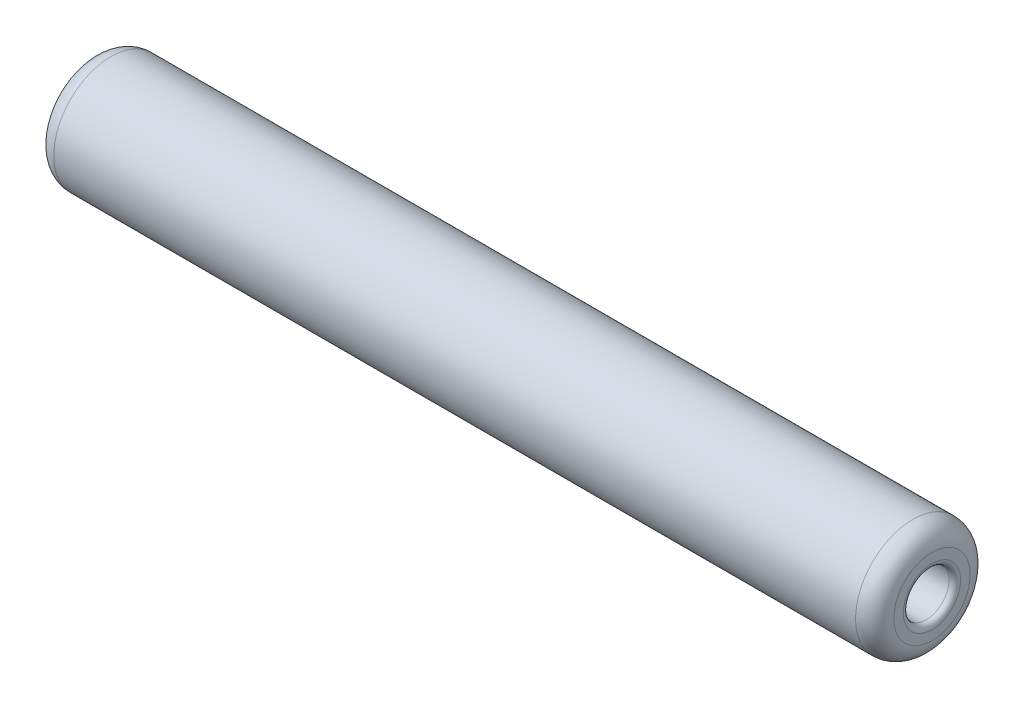
ISO-10303-21;
HEADER;
FILE_DESCRIPTION(('STEP AP214'),'2;1');
FILE_NAME('part.step','',(''),(''),'','','');
FILE_SCHEMA(('AUTOMOTIVE_DESIGN { 1 0 10303 214 1 1 1 1 }'));
ENDSEC;
DATA;
#1=APPLICATION_CONTEXT('core data for automotive mechanical design processes');
#2=APPLICATION_PROTOCOL_DEFINITION('international standard','automotive_design',2000,#1);
#3=PRODUCT_CONTEXT('',#1,'mechanical');
#4=PRODUCT('Part','Part','',(#3));
#5=PRODUCT_RELATED_PRODUCT_CATEGORY('part','',(#4));
#6=PRODUCT_DEFINITION_FORMATION('','',#4);
#7=PRODUCT_DEFINITION_CONTEXT('part definition',#1,'design');
#8=PRODUCT_DEFINITION('design','',#6,#7);
#9=PRODUCT_DEFINITION_SHAPE('','',#8);
#10=(LENGTH_UNIT() NAMED_UNIT(*) SI_UNIT(.MILLI.,.METRE.));
#11=(NAMED_UNIT(*) PLANE_ANGLE_UNIT() SI_UNIT($,.RADIAN.));
#12=(NAMED_UNIT(*) SI_UNIT($,.STERADIAN.) SOLID_ANGLE_UNIT());
#13=UNCERTAINTY_MEASURE_WITH_UNIT(LENGTH_MEASURE(1.E-05),#10,'distance_accuracy_value','');
#14=(GEOMETRIC_REPRESENTATION_CONTEXT(3) GLOBAL_UNCERTAINTY_ASSIGNED_CONTEXT((#13)) GLOBAL_UNIT_ASSIGNED_CONTEXT((#10,
#11,#12)) REPRESENTATION_CONTEXT('',''));
#15=CARTESIAN_POINT('',(0.,0.,0.));
#16=DIRECTION('',(0.,0.,1.));
#17=DIRECTION('',(1.,0.,0.));
#18=AXIS2_PLACEMENT_3D('',#15,#16,#17);
#19=CARTESIAN_POINT('',(44.,0.,0.));
#20=DIRECTION('',(-1.,0.,0.));
#21=DIRECTION('',(0.,0.,1.));
#22=AXIS2_PLACEMENT_3D('',#19,#20,#21);
#23=CYLINDRICAL_SURFACE('',#22,3.);
#24=CARTESIAN_POINT('',(43.,0.,0.));
#25=DIRECTION('',(1.,0.,0.));
#26=DIRECTION('',(0.,0.,-1.));
#27=AXIS2_PLACEMENT_3D('',#24,#25,#26);
#28=CIRCLE('',#27,3.);
#29=CARTESIAN_POINT('',(43.,0.,-3.));
#30=VERTEX_POINT('',#29);
#31=EDGE_CURVE('E60',#30,#30,#28,.F.);
#32=ORIENTED_EDGE('',*,*,#31,.T.);
#33=EDGE_LOOP('',(#32));
#34=FACE_BOUND('',#33,.T.);
#35=CARTESIAN_POINT('',(1.,0.,0.));
#36=DIRECTION('',(1.,0.,0.));
#37=DIRECTION('',(0.,0.,-1.));
#38=AXIS2_PLACEMENT_3D('',#35,#36,#37);
#39=CIRCLE('',#38,3.);
#40=CARTESIAN_POINT('',(1.,0.,-3.));
#41=VERTEX_POINT('',#40);
#42=EDGE_CURVE('E63',#41,#41,#39,.T.);
#43=ORIENTED_EDGE('',*,*,#42,.T.);
#44=EDGE_LOOP('',(#43));
#45=FACE_BOUND('',#44,.T.);
#46=ADVANCED_FACE('F37',(#34,#45),#23,.T.);
#47=CARTESIAN_POINT('',(44.,0.,0.));
#48=DIRECTION('',(1.,0.,0.));
#49=DIRECTION('',(0.,0.,-1.));
#50=AXIS2_PLACEMENT_3D('',#47,#48,#49);
#51=PLANE('',#50);
#52=CARTESIAN_POINT('',(44.,0.,0.));
#53=DIRECTION('',(1.,0.,0.));
#54=DIRECTION('',(0.,0.,-1.));
#55=AXIS2_PLACEMENT_3D('',#52,#53,#54);
#56=CIRCLE('',#55,1.5);
#57=CARTESIAN_POINT('',(44.,0.,-1.5));
#58=VERTEX_POINT('',#57);
#59=EDGE_CURVE('E52',#58,#58,#56,.F.);
#60=ORIENTED_EDGE('',*,*,#59,.T.);
#61=EDGE_LOOP('',(#60));
#62=FACE_BOUND('',#61,.T.);
#63=CARTESIAN_POINT('',(44.,0.,0.));
#64=DIRECTION('',(1.,0.,0.));
#65=DIRECTION('',(0.,0.,-1.));
#66=AXIS2_PLACEMENT_3D('',#63,#64,#65);
#67=CIRCLE('',#66,2.);
#68=CARTESIAN_POINT('',(44.,0.,-2.));
#69=VERTEX_POINT('',#68);
#70=EDGE_CURVE('E66',#69,#69,#67,.T.);
#71=ORIENTED_EDGE('',*,*,#70,.T.);
#72=EDGE_LOOP('',(#71));
#73=FACE_BOUND('',#72,.T.);
#74=ADVANCED_FACE('F70',(#62,#73),#51,.T.);
#75=CARTESIAN_POINT('',(0.,0.,0.));
#76=DIRECTION('',(1.,0.,0.));
#77=DIRECTION('',(0.,0.,-1.));
#78=AXIS2_PLACEMENT_3D('',#75,#76,#77);
#79=PLANE('',#78);
#80=CARTESIAN_POINT('',(0.,0.,0.));
#81=DIRECTION('',(1.,0.,0.));
#82=DIRECTION('',(0.,0.,-1.));
#83=AXIS2_PLACEMENT_3D('',#80,#81,#82);
#84=CIRCLE('',#83,1.5);
#85=CARTESIAN_POINT('',(0.,0.,-1.5));
#86=VERTEX_POINT('',#85);
#87=EDGE_CURVE('E10',#86,#86,#84,.T.);
#88=ORIENTED_EDGE('',*,*,#87,.T.);
#89=EDGE_LOOP('',(#88));
#90=FACE_BOUND('',#89,.T.);
#91=CARTESIAN_POINT('',(0.,0.,0.));
#92=DIRECTION('',(1.,0.,0.));
#93=DIRECTION('',(0.,0.,-1.));
#94=AXIS2_PLACEMENT_3D('',#91,#92,#93);
#95=CIRCLE('',#94,2.);
#96=CARTESIAN_POINT('',(0.,0.,-2.));
#97=VERTEX_POINT('',#96);
#98=EDGE_CURVE('E57',#97,#97,#95,.F.);
#99=ORIENTED_EDGE('',*,*,#98,.T.);
#100=EDGE_LOOP('',(#99));
#101=FACE_BOUND('',#100,.T.);
#102=ADVANCED_FACE('F86',(#90,#101),#79,.F.);
#103=CARTESIAN_POINT('',(44.,0.,0.));
#104=DIRECTION('',(-1.,0.,0.));
#105=DIRECTION('',(0.,0.,1.));
#106=AXIS2_PLACEMENT_3D('',#103,#104,#105);
#107=CYLINDRICAL_SURFACE('',#106,1.2);
#108=CARTESIAN_POINT('',(43.7,0.,0.));
#109=DIRECTION('',(1.,0.,0.));
#110=DIRECTION('',(0.,0.,-1.));
#111=AXIS2_PLACEMENT_3D('',#108,#109,#110);
#112=CIRCLE('',#111,1.2);
#113=CARTESIAN_POINT('',(43.7,0.,-1.2));
#114=VERTEX_POINT('',#113);
#115=EDGE_CURVE('E44',#114,#114,#112,.T.);
#116=ORIENTED_EDGE('',*,*,#115,.T.);
#117=EDGE_LOOP('',(#116));
#118=FACE_BOUND('',#117,.T.);
#119=CARTESIAN_POINT('',(0.300000000000002,0.,0.));
#120=DIRECTION('',(1.,0.,0.));
#121=DIRECTION('',(0.,0.,-1.));
#122=AXIS2_PLACEMENT_3D('',#119,#120,#121);
#123=CIRCLE('',#122,1.2);
#124=CARTESIAN_POINT('',(0.300000000000002,0.,-1.2));
#125=VERTEX_POINT('',#124);
#126=EDGE_CURVE('E48',#125,#125,#123,.F.);
#127=ORIENTED_EDGE('',*,*,#126,.T.);
#128=EDGE_LOOP('',(#127));
#129=FACE_BOUND('',#128,.T.);
#130=ADVANCED_FACE('F75',(#118,#129),#107,.F.);
#131=CARTESIAN_POINT('',(43.,0.,0.));
#132=DIRECTION('',(1.,0.,0.));
#133=DIRECTION('',(0.,0.,-1.));
#134=AXIS2_PLACEMENT_3D('',#131,#132,#133);
#135=TOROIDAL_SURFACE('',#134,2.,1.);
#136=ORIENTED_EDGE('',*,*,#31,.F.);
#137=EDGE_LOOP('',(#136));
#138=FACE_BOUND('',#137,.T.);
#139=ORIENTED_EDGE('',*,*,#70,.F.);
#140=EDGE_LOOP('',(#139));
#141=FACE_BOUND('',#140,.T.);
#142=ADVANCED_FACE('F72',(#138,#141),#135,.T.);
#143=CARTESIAN_POINT('',(1.,0.,0.));
#144=DIRECTION('',(1.,0.,0.));
#145=DIRECTION('',(0.,0.,-1.));
#146=AXIS2_PLACEMENT_3D('',#143,#144,#145);
#147=TOROIDAL_SURFACE('',#146,2.,1.);
#148=ORIENTED_EDGE('',*,*,#98,.F.);
#149=EDGE_LOOP('',(#148));
#150=FACE_BOUND('',#149,.T.);
#151=ORIENTED_EDGE('',*,*,#42,.F.);
#152=EDGE_LOOP('',(#151));
#153=FACE_BOUND('',#152,.T.);
#154=ADVANCED_FACE('F74',(#150,#153),#147,.T.);
#155=CARTESIAN_POINT('',(43.7,0.,0.));
#156=DIRECTION('',(1.,0.,0.));
#157=DIRECTION('',(0.,0.,-1.));
#158=AXIS2_PLACEMENT_3D('',#155,#156,#157);
#159=TOROIDAL_SURFACE('',#158,1.5,0.3);
#160=ORIENTED_EDGE('',*,*,#115,.F.);
#161=EDGE_LOOP('',(#160));
#162=FACE_BOUND('',#161,.T.);
#163=ORIENTED_EDGE('',*,*,#59,.F.);
#164=EDGE_LOOP('',(#163));
#165=FACE_BOUND('',#164,.T.);
#166=ADVANCED_FACE('F82',(#162,#165),#159,.T.);
#167=CARTESIAN_POINT('',(0.300000000000002,0.,0.));
#168=DIRECTION('',(1.,0.,0.));
#169=DIRECTION('',(0.,0.,-1.));
#170=AXIS2_PLACEMENT_3D('',#167,#168,#169);
#171=TOROIDAL_SURFACE('',#170,1.5,0.3);
#172=ORIENTED_EDGE('',*,*,#87,.F.);
#173=EDGE_LOOP('',(#172));
#174=FACE_BOUND('',#173,.T.);
#175=ORIENTED_EDGE('',*,*,#126,.F.);
#176=EDGE_LOOP('',(#175));
#177=FACE_BOUND('',#176,.T.);
#178=ADVANCED_FACE('F39',(#174,#177),#171,.T.);
#179=CLOSED_SHELL('',(#46,#74,#102,#130,#142,#154,#166,#178));
#180=MANIFOLD_SOLID_BREP('B2',#179);
#181=ADVANCED_BREP_SHAPE_REPRESENTATION('',(#18,#180),#14);
#182=SHAPE_DEFINITION_REPRESENTATION(#9,#181);
ENDSEC;
END-ISO-10303-21;
